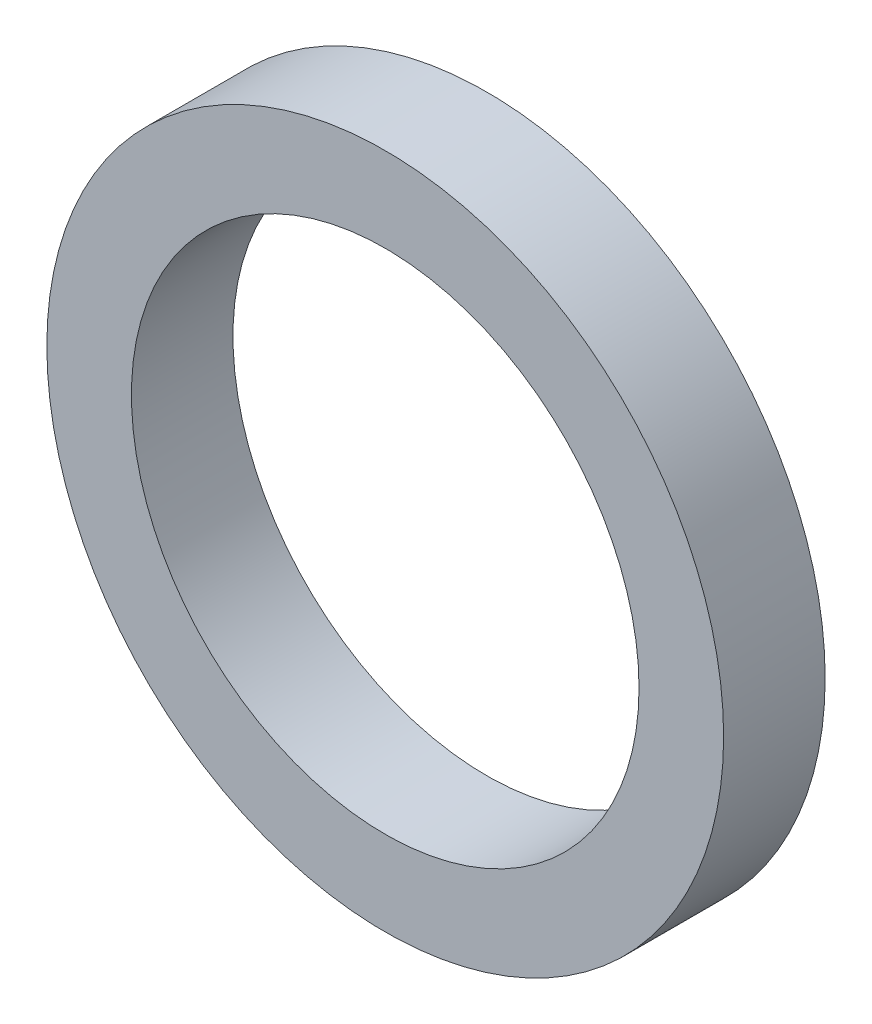
ISO-10303-21;
HEADER;
FILE_DESCRIPTION(('STEP AP214'),'2;1');
FILE_NAME('part.step','',(''),(''),'','','');
FILE_SCHEMA(('AUTOMOTIVE_DESIGN { 1 0 10303 214 1 1 1 1 }'));
ENDSEC;
DATA;
#1=APPLICATION_CONTEXT('core data for automotive mechanical design processes');
#2=APPLICATION_PROTOCOL_DEFINITION('international standard','automotive_design',2000,#1);
#3=PRODUCT_CONTEXT('',#1,'mechanical');
#4=PRODUCT('Part','Part','',(#3));
#5=PRODUCT_RELATED_PRODUCT_CATEGORY('part','',(#4));
#6=PRODUCT_DEFINITION_FORMATION('','',#4);
#7=PRODUCT_DEFINITION_CONTEXT('part definition',#1,'design');
#8=PRODUCT_DEFINITION('design','',#6,#7);
#9=PRODUCT_DEFINITION_SHAPE('','',#8);
#10=(LENGTH_UNIT() NAMED_UNIT(*) SI_UNIT(.MILLI.,.METRE.));
#11=(NAMED_UNIT(*) PLANE_ANGLE_UNIT() SI_UNIT($,.RADIAN.));
#12=(NAMED_UNIT(*) SI_UNIT($,.STERADIAN.) SOLID_ANGLE_UNIT());
#13=UNCERTAINTY_MEASURE_WITH_UNIT(LENGTH_MEASURE(1.E-05),#10,'distance_accuracy_value','');
#14=(GEOMETRIC_REPRESENTATION_CONTEXT(3) GLOBAL_UNCERTAINTY_ASSIGNED_CONTEXT((#13)) GLOBAL_UNIT_ASSIGNED_CONTEXT((#10,
#11,#12)) REPRESENTATION_CONTEXT('',''));
#15=CARTESIAN_POINT('',(0.,0.,0.));
#16=DIRECTION('',(0.,0.,1.));
#17=DIRECTION('',(1.,0.,0.));
#18=AXIS2_PLACEMENT_3D('',#15,#16,#17);
#19=CARTESIAN_POINT('',(0.,0.,6.));
#20=DIRECTION('',(0.,0.,1.));
#21=DIRECTION('',(1.,0.,0.));
#22=AXIS2_PLACEMENT_3D('',#19,#20,#21);
#23=PLANE('',#22);
#24=CARTESIAN_POINT('',(0.,0.,6.));
#25=DIRECTION('',(0.,0.,1.));
#26=DIRECTION('',(1.,0.,0.));
#27=AXIS2_PLACEMENT_3D('',#24,#25,#26);
#28=CIRCLE('',#27,20.);
#29=CARTESIAN_POINT('',(20.,0.,6.));
#30=VERTEX_POINT('',#29);
#31=EDGE_CURVE('E10',#30,#30,#28,.T.);
#32=ORIENTED_EDGE('',*,*,#31,.T.);
#33=EDGE_LOOP('',(#32));
#34=FACE_BOUND('',#33,.T.);
#35=CARTESIAN_POINT('',(0.,0.,6.));
#36=DIRECTION('',(0.,0.,1.));
#37=DIRECTION('',(1.,0.,0.));
#38=AXIS2_PLACEMENT_3D('',#35,#36,#37);
#39=CIRCLE('',#38,15.);
#40=CARTESIAN_POINT('',(15.,0.,6.));
#41=VERTEX_POINT('',#40);
#42=EDGE_CURVE('E40',#41,#41,#39,.T.);
#43=ORIENTED_EDGE('',*,*,#42,.F.);
#44=EDGE_LOOP('',(#43));
#45=FACE_BOUND('',#44,.T.);
#46=ADVANCED_FACE('F29',(#34,#45),#23,.T.);
#47=CARTESIAN_POINT('',(0.,0.,0.));
#48=DIRECTION('',(0.,0.,1.));
#49=DIRECTION('',(1.,0.,0.));
#50=AXIS2_PLACEMENT_3D('',#47,#48,#49);
#51=PLANE('',#50);
#52=CARTESIAN_POINT('',(0.,0.,0.));
#53=DIRECTION('',(0.,0.,1.));
#54=DIRECTION('',(1.,0.,0.));
#55=AXIS2_PLACEMENT_3D('',#52,#53,#54);
#56=CIRCLE('',#55,20.);
#57=CARTESIAN_POINT('',(20.,0.,0.));
#58=VERTEX_POINT('',#57);
#59=EDGE_CURVE('E33',#58,#58,#56,.T.);
#60=ORIENTED_EDGE('',*,*,#59,.F.);
#61=EDGE_LOOP('',(#60));
#62=FACE_BOUND('',#61,.T.);
#63=CARTESIAN_POINT('',(0.,0.,0.));
#64=DIRECTION('',(0.,0.,1.));
#65=DIRECTION('',(1.,0.,0.));
#66=AXIS2_PLACEMENT_3D('',#63,#64,#65);
#67=CIRCLE('',#66,15.);
#68=CARTESIAN_POINT('',(15.,0.,0.));
#69=VERTEX_POINT('',#68);
#70=EDGE_CURVE('E42',#69,#69,#67,.T.);
#71=ORIENTED_EDGE('',*,*,#70,.T.);
#72=EDGE_LOOP('',(#71));
#73=FACE_BOUND('',#72,.T.);
#74=ADVANCED_FACE('F52',(#62,#73),#51,.F.);
#75=CARTESIAN_POINT('',(0.,0.,6.));
#76=DIRECTION('',(0.,0.,-1.));
#77=DIRECTION('',(-1.,0.,0.));
#78=AXIS2_PLACEMENT_3D('',#75,#76,#77);
#79=CYLINDRICAL_SURFACE('',#78,20.);
#80=ORIENTED_EDGE('',*,*,#31,.F.);
#81=EDGE_LOOP('',(#80));
#82=FACE_BOUND('',#81,.T.);
#83=ORIENTED_EDGE('',*,*,#59,.T.);
#84=EDGE_LOOP('',(#83));
#85=FACE_BOUND('',#84,.T.);
#86=ADVANCED_FACE('F31',(#82,#85),#79,.T.);
#87=CARTESIAN_POINT('',(0.,0.,6.));
#88=DIRECTION('',(0.,0.,-1.));
#89=DIRECTION('',(-1.,0.,0.));
#90=AXIS2_PLACEMENT_3D('',#87,#88,#89);
#91=CYLINDRICAL_SURFACE('',#90,15.);
#92=ORIENTED_EDGE('',*,*,#42,.T.);
#93=EDGE_LOOP('',(#92));
#94=FACE_BOUND('',#93,.T.);
#95=ORIENTED_EDGE('',*,*,#70,.F.);
#96=EDGE_LOOP('',(#95));
#97=FACE_BOUND('',#96,.T.);
#98=ADVANCED_FACE('F48',(#94,#97),#91,.F.);
#99=CLOSED_SHELL('',(#46,#74,#86,#98));
#100=MANIFOLD_SOLID_BREP('B2',#99);
#101=ADVANCED_BREP_SHAPE_REPRESENTATION('',(#18,#100),#14);
#102=SHAPE_DEFINITION_REPRESENTATION(#9,#101);
ENDSEC;
END-ISO-10303-21;
